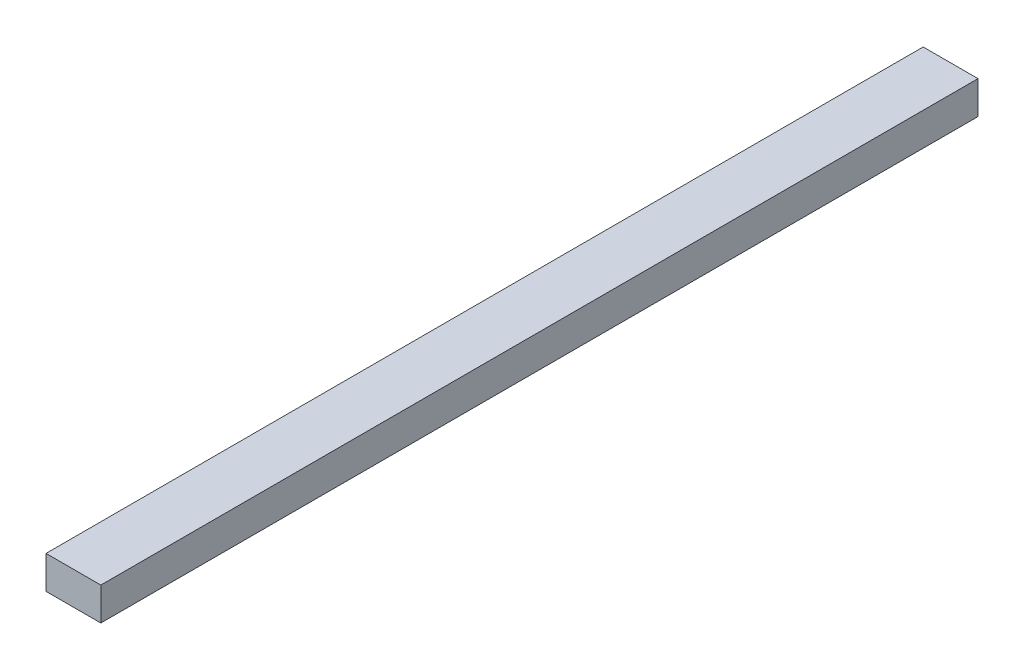
ISO-10303-21;
HEADER;
FILE_DESCRIPTION(('STEP AP214'),'2;1');
FILE_NAME('part.step','',(''),(''),'','','');
FILE_SCHEMA(('AUTOMOTIVE_DESIGN { 1 0 10303 214 1 1 1 1 }'));
ENDSEC;
DATA;
#1=APPLICATION_CONTEXT('core data for automotive mechanical design processes');
#2=APPLICATION_PROTOCOL_DEFINITION('international standard','automotive_design',2000,#1);
#3=PRODUCT_CONTEXT('',#1,'mechanical');
#4=PRODUCT('Part','Part','',(#3));
#5=PRODUCT_RELATED_PRODUCT_CATEGORY('part','',(#4));
#6=PRODUCT_DEFINITION_FORMATION('','',#4);
#7=PRODUCT_DEFINITION_CONTEXT('part definition',#1,'design');
#8=PRODUCT_DEFINITION('design','',#6,#7);
#9=PRODUCT_DEFINITION_SHAPE('','',#8);
#10=(LENGTH_UNIT() NAMED_UNIT(*) SI_UNIT(.MILLI.,.METRE.));
#11=(NAMED_UNIT(*) PLANE_ANGLE_UNIT() SI_UNIT($,.RADIAN.));
#12=(NAMED_UNIT(*) SI_UNIT($,.STERADIAN.) SOLID_ANGLE_UNIT());
#13=UNCERTAINTY_MEASURE_WITH_UNIT(LENGTH_MEASURE(1.E-05),#10,'distance_accuracy_value','');
#14=(GEOMETRIC_REPRESENTATION_CONTEXT(3) GLOBAL_UNCERTAINTY_ASSIGNED_CONTEXT((#13)) GLOBAL_UNIT_ASSIGNED_CONTEXT((#10,
#11,#12)) REPRESENTATION_CONTEXT('',''));
#15=CARTESIAN_POINT('',(0.,0.,0.));
#16=DIRECTION('',(0.,0.,1.));
#17=DIRECTION('',(1.,0.,0.));
#18=AXIS2_PLACEMENT_3D('',#15,#16,#17);
#19=CARTESIAN_POINT('',(25.,-15.,400.));
#20=DIRECTION('',(-1.,0.,0.));
#21=DIRECTION('',(0.,0.,1.));
#22=AXIS2_PLACEMENT_3D('',#19,#20,#21);
#23=PLANE('',#22);
#24=DIRECTION('',(0.,1.,0.));
#25=VECTOR('',#24,1.);
#26=CARTESIAN_POINT('',(25.,-15.,-400.));
#27=LINE('',#26,#25);
#28=CARTESIAN_POINT('',(25.,-15.,-400.));
#29=VERTEX_POINT('',#28);
#30=CARTESIAN_POINT('',(25.,15.,-400.));
#31=VERTEX_POINT('',#30);
#32=EDGE_CURVE('E103',#29,#31,#27,.T.);
#33=ORIENTED_EDGE('',*,*,#32,.T.);
#34=DIRECTION('',(0.,0.,-1.));
#35=VECTOR('',#34,1.);
#36=CARTESIAN_POINT('',(25.,15.,400.));
#37=LINE('',#36,#35);
#38=CARTESIAN_POINT('',(25.,15.,400.));
#39=VERTEX_POINT('',#38);
#40=EDGE_CURVE('E11',#39,#31,#37,.T.);
#41=ORIENTED_EDGE('',*,*,#40,.F.);
#42=DIRECTION('',(0.,1.,0.));
#43=VECTOR('',#42,1.);
#44=CARTESIAN_POINT('',(25.,-15.,400.));
#45=LINE('',#44,#43);
#46=CARTESIAN_POINT('',(25.,-15.,400.));
#47=VERTEX_POINT('',#46);
#48=EDGE_CURVE('E86',#47,#39,#45,.T.);
#49=ORIENTED_EDGE('',*,*,#48,.F.);
#50=DIRECTION('',(0.,0.,-1.));
#51=VECTOR('',#50,1.);
#52=CARTESIAN_POINT('',(25.,-15.,400.));
#53=LINE('',#52,#51);
#54=EDGE_CURVE('E99',#47,#29,#53,.T.);
#55=ORIENTED_EDGE('',*,*,#54,.T.);
#56=EDGE_LOOP('',(#33,#41,#49,#55));
#57=FACE_BOUND('',#56,.T.);
#58=ADVANCED_FACE('F34',(#57),#23,.F.);
#59=CARTESIAN_POINT('',(-25.,15.,400.));
#60=DIRECTION('',(0.,-1.,0.));
#61=DIRECTION('',(1.,0.,0.));
#62=AXIS2_PLACEMENT_3D('',#59,#60,#61);
#63=PLANE('',#62);
#64=DIRECTION('',(-1.,0.,0.));
#65=VECTOR('',#64,1.);
#66=CARTESIAN_POINT('',(-25.,15.,-400.));
#67=LINE('',#66,#65);
#68=CARTESIAN_POINT('',(-25.,15.,-400.));
#69=VERTEX_POINT('',#68);
#70=EDGE_CURVE('E91',#31,#69,#67,.T.);
#71=ORIENTED_EDGE('',*,*,#70,.T.);
#72=DIRECTION('',(0.,0.,-1.));
#73=VECTOR('',#72,1.);
#74=CARTESIAN_POINT('',(-25.,15.,400.));
#75=LINE('',#74,#73);
#76=CARTESIAN_POINT('',(-25.,15.,400.));
#77=VERTEX_POINT('',#76);
#78=EDGE_CURVE('E43',#77,#69,#75,.T.);
#79=ORIENTED_EDGE('',*,*,#78,.F.);
#80=DIRECTION('',(-1.,0.,0.));
#81=VECTOR('',#80,1.);
#82=CARTESIAN_POINT('',(-25.,15.,400.));
#83=LINE('',#82,#81);
#84=EDGE_CURVE('E81',#39,#77,#83,.T.);
#85=ORIENTED_EDGE('',*,*,#84,.F.);
#86=ORIENTED_EDGE('',*,*,#40,.T.);
#87=EDGE_LOOP('',(#71,#79,#85,#86));
#88=FACE_BOUND('',#87,.T.);
#89=ADVANCED_FACE('F90',(#88),#63,.F.);
#90=CARTESIAN_POINT('',(-25.,-15.,400.));
#91=DIRECTION('',(1.,0.,0.));
#92=DIRECTION('',(0.,1.,0.));
#93=AXIS2_PLACEMENT_3D('',#90,#91,#92);
#94=PLANE('',#93);
#95=DIRECTION('',(0.,-1.,0.));
#96=VECTOR('',#95,1.);
#97=CARTESIAN_POINT('',(-25.,-15.,-400.));
#98=LINE('',#97,#96);
#99=CARTESIAN_POINT('',(-25.,-15.,-400.));
#100=VERTEX_POINT('',#99);
#101=EDGE_CURVE('E68',#69,#100,#98,.T.);
#102=ORIENTED_EDGE('',*,*,#101,.T.);
#103=DIRECTION('',(0.,0.,-1.));
#104=VECTOR('',#103,1.);
#105=CARTESIAN_POINT('',(-25.,-15.,400.));
#106=LINE('',#105,#104);
#107=CARTESIAN_POINT('',(-25.,-15.,400.));
#108=VERTEX_POINT('',#107);
#109=EDGE_CURVE('E93',#108,#100,#106,.T.);
#110=ORIENTED_EDGE('',*,*,#109,.F.);
#111=DIRECTION('',(0.,-1.,0.));
#112=VECTOR('',#111,1.);
#113=CARTESIAN_POINT('',(-25.,-15.,400.));
#114=LINE('',#113,#112);
#115=EDGE_CURVE('E84',#77,#108,#114,.T.);
#116=ORIENTED_EDGE('',*,*,#115,.F.);
#117=ORIENTED_EDGE('',*,*,#78,.T.);
#118=EDGE_LOOP('',(#102,#110,#116,#117));
#119=FACE_BOUND('',#118,.T.);
#120=ADVANCED_FACE('F94',(#119),#94,.F.);
#121=CARTESIAN_POINT('',(-25.,-15.,400.));
#122=DIRECTION('',(0.,1.,0.));
#123=DIRECTION('',(-1.,0.,0.));
#124=AXIS2_PLACEMENT_3D('',#121,#122,#123);
#125=PLANE('',#124);
#126=DIRECTION('',(1.,0.,0.));
#127=VECTOR('',#126,1.);
#128=CARTESIAN_POINT('',(-25.,-15.,-400.));
#129=LINE('',#128,#127);
#130=EDGE_CURVE('E74',#100,#29,#129,.T.);
#131=ORIENTED_EDGE('',*,*,#130,.T.);
#132=ORIENTED_EDGE('',*,*,#54,.F.);
#133=DIRECTION('',(1.,0.,0.));
#134=VECTOR('',#133,1.);
#135=CARTESIAN_POINT('',(-25.,-15.,400.));
#136=LINE('',#135,#134);
#137=EDGE_CURVE('E51',#108,#47,#136,.T.);
#138=ORIENTED_EDGE('',*,*,#137,.F.);
#139=ORIENTED_EDGE('',*,*,#109,.T.);
#140=EDGE_LOOP('',(#131,#132,#138,#139));
#141=FACE_BOUND('',#140,.T.);
#142=ADVANCED_FACE('F117',(#141),#125,.F.);
#143=CARTESIAN_POINT('',(0.,0.,400.));
#144=DIRECTION('',(0.,0.,-1.));
#145=DIRECTION('',(-1.,0.,0.));
#146=AXIS2_PLACEMENT_3D('',#143,#144,#145);
#147=PLANE('',#146);
#148=ORIENTED_EDGE('',*,*,#48,.T.);
#149=ORIENTED_EDGE('',*,*,#84,.T.);
#150=ORIENTED_EDGE('',*,*,#115,.T.);
#151=ORIENTED_EDGE('',*,*,#137,.T.);
#152=EDGE_LOOP('',(#148,#149,#150,#151));
#153=FACE_BOUND('',#152,.T.);
#154=ADVANCED_FACE('F82',(#153),#147,.F.);
#155=CARTESIAN_POINT('',(0.,0.,-400.));
#156=DIRECTION('',(0.,0.,-1.));
#157=DIRECTION('',(-1.,0.,0.));
#158=AXIS2_PLACEMENT_3D('',#155,#156,#157);
#159=PLANE('',#158);
#160=ORIENTED_EDGE('',*,*,#32,.F.);
#161=ORIENTED_EDGE('',*,*,#130,.F.);
#162=ORIENTED_EDGE('',*,*,#101,.F.);
#163=ORIENTED_EDGE('',*,*,#70,.F.);
#164=EDGE_LOOP('',(#160,#161,#162,#163));
#165=FACE_BOUND('',#164,.T.);
#166=ADVANCED_FACE('F120',(#165),#159,.T.);
#167=CLOSED_SHELL('',(#58,#89,#120,#142,#154,#166));
#168=MANIFOLD_SOLID_BREP('B2',#167);
#169=ADVANCED_BREP_SHAPE_REPRESENTATION('',(#18,#168),#14);
#170=SHAPE_DEFINITION_REPRESENTATION(#9,#169);
ENDSEC;
END-ISO-10303-21;
